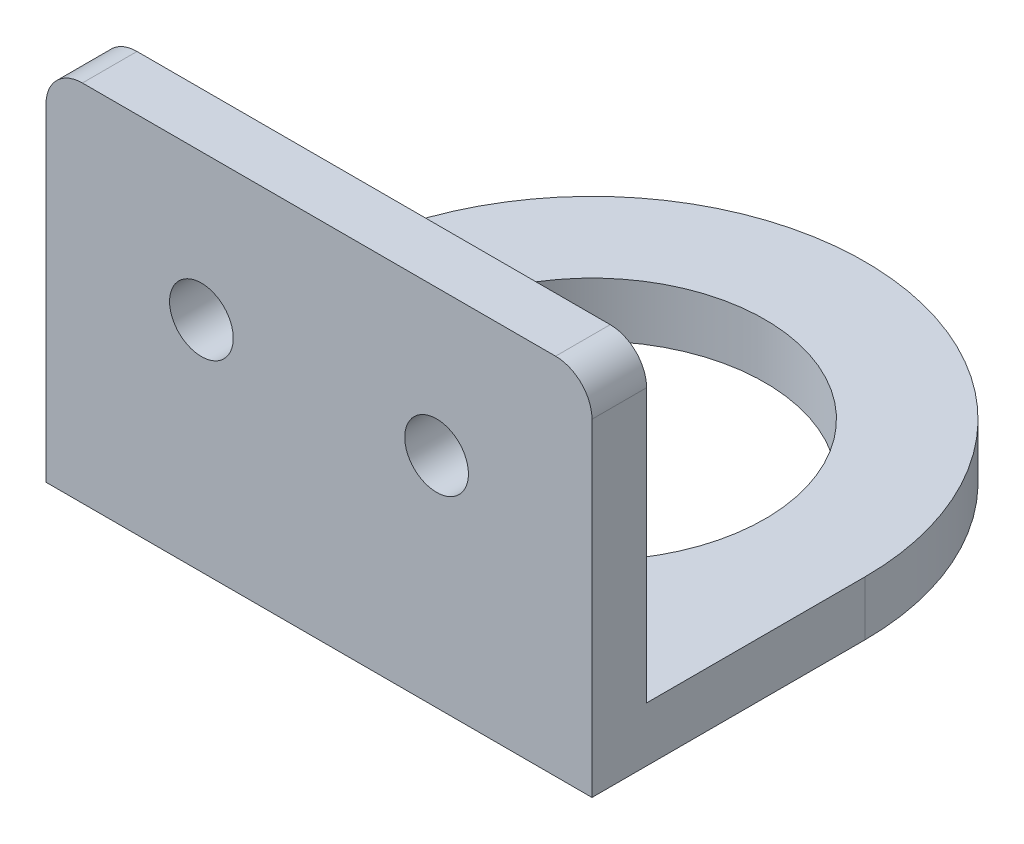
ISO-10303-21;
HEADER;
FILE_DESCRIPTION(('STEP AP214'),'2;1');
FILE_NAME('part.step','',(''),(''),'','','');
FILE_SCHEMA(('AUTOMOTIVE_DESIGN { 1 0 10303 214 1 1 1 1 }'));
ENDSEC;
DATA;
#1=APPLICATION_CONTEXT('core data for automotive mechanical design processes');
#2=APPLICATION_PROTOCOL_DEFINITION('international standard','automotive_design',2000,#1);
#3=PRODUCT_CONTEXT('',#1,'mechanical');
#4=PRODUCT('Part','Part','',(#3));
#5=PRODUCT_RELATED_PRODUCT_CATEGORY('part','',(#4));
#6=PRODUCT_DEFINITION_FORMATION('','',#4);
#7=PRODUCT_DEFINITION_CONTEXT('part definition',#1,'design');
#8=PRODUCT_DEFINITION('design','',#6,#7);
#9=PRODUCT_DEFINITION_SHAPE('','',#8);
#10=(LENGTH_UNIT() NAMED_UNIT(*) SI_UNIT(.MILLI.,.METRE.));
#11=(NAMED_UNIT(*) PLANE_ANGLE_UNIT() SI_UNIT($,.RADIAN.));
#12=(NAMED_UNIT(*) SI_UNIT($,.STERADIAN.) SOLID_ANGLE_UNIT());
#13=UNCERTAINTY_MEASURE_WITH_UNIT(LENGTH_MEASURE(1.E-05),#10,'distance_accuracy_value','');
#14=(GEOMETRIC_REPRESENTATION_CONTEXT(3) GLOBAL_UNCERTAINTY_ASSIGNED_CONTEXT((#13)) GLOBAL_UNIT_ASSIGNED_CONTEXT((#10,
#11,#12)) REPRESENTATION_CONTEXT('',''));
#15=CARTESIAN_POINT('',(0.,0.,0.));
#16=DIRECTION('',(0.,0.,1.));
#17=DIRECTION('',(1.,0.,0.));
#18=AXIS2_PLACEMENT_3D('',#15,#16,#17);
#19=CARTESIAN_POINT('',(0.,3.,15.));
#20=DIRECTION('',(0.,0.,-1.));
#21=DIRECTION('',(-1.,0.,0.));
#22=AXIS2_PLACEMENT_3D('',#19,#20,#21);
#23=PLANE('',#22);
#24=CARTESIAN_POINT('',(-6.4613791443171,12.,15.));
#25=DIRECTION('',(0.,0.,-1.));
#26=DIRECTION('',(-1.,0.,0.));
#27=AXIS2_PLACEMENT_3D('',#24,#25,#26);
#28=CIRCLE('',#27,1.75);
#29=CARTESIAN_POINT('',(-8.2113791443171,12.,15.));
#30=VERTEX_POINT('',#29);
#31=EDGE_CURVE('E246',#30,#30,#28,.T.);
#32=ORIENTED_EDGE('',*,*,#31,.T.);
#33=EDGE_LOOP('',(#32));
#34=FACE_BOUND('',#33,.T.);
#35=DIRECTION('',(0.,-1.,0.));
#36=VECTOR('',#35,1.);
#37=CARTESIAN_POINT('',(15.,3.,15.));
#38=LINE('',#37,#36);
#39=CARTESIAN_POINT('',(15.,18.,15.));
#40=VERTEX_POINT('',#39);
#41=CARTESIAN_POINT('',(15.,0.,15.));
#42=VERTEX_POINT('',#41);
#43=EDGE_CURVE('E138',#40,#42,#38,.T.);
#44=ORIENTED_EDGE('',*,*,#43,.F.);
#45=CARTESIAN_POINT('',(13.,18.,15.));
#46=DIRECTION('',(0.,0.,-1.));
#47=DIRECTION('',(-1.,0.,0.));
#48=AXIS2_PLACEMENT_3D('',#45,#46,#47);
#49=CIRCLE('',#48,2.);
#50=CARTESIAN_POINT('',(13.,20.,15.));
#51=VERTEX_POINT('',#50);
#52=EDGE_CURVE('E158',#40,#51,#49,.F.);
#53=ORIENTED_EDGE('',*,*,#52,.T.);
#54=DIRECTION('',(-1.,0.,0.));
#55=VECTOR('',#54,1.);
#56=CARTESIAN_POINT('',(-15.,20.,15.));
#57=LINE('',#56,#55);
#58=CARTESIAN_POINT('',(-13.,20.,15.));
#59=VERTEX_POINT('',#58);
#60=EDGE_CURVE('E181',#51,#59,#57,.T.);
#61=ORIENTED_EDGE('',*,*,#60,.T.);
#62=CARTESIAN_POINT('',(-13.,18.,15.));
#63=DIRECTION('',(0.,0.,-1.));
#64=DIRECTION('',(-1.,0.,0.));
#65=AXIS2_PLACEMENT_3D('',#62,#63,#64);
#66=CIRCLE('',#65,2.);
#67=CARTESIAN_POINT('',(-15.,18.,15.));
#68=VERTEX_POINT('',#67);
#69=EDGE_CURVE('E156',#59,#68,#66,.F.);
#70=ORIENTED_EDGE('',*,*,#69,.T.);
#71=DIRECTION('',(0.,-1.,0.));
#72=VECTOR('',#71,1.);
#73=CARTESIAN_POINT('',(-15.,3.,15.));
#74=LINE('',#73,#72);
#75=CARTESIAN_POINT('',(-15.,0.,15.));
#76=VERTEX_POINT('',#75);
#77=EDGE_CURVE('E151',#68,#76,#74,.T.);
#78=ORIENTED_EDGE('',*,*,#77,.T.);
#79=DIRECTION('',(1.,0.,0.));
#80=VECTOR('',#79,1.);
#81=CARTESIAN_POINT('',(0.,0.,15.));
#82=LINE('',#81,#80);
#83=EDGE_CURVE('E133',#76,#42,#82,.T.);
#84=ORIENTED_EDGE('',*,*,#83,.T.);
#85=EDGE_LOOP('',(#44,#53,#61,#70,#78,#84));
#86=FACE_BOUND('',#85,.T.);
#87=CARTESIAN_POINT('',(6.4613791443171,12.,15.));
#88=DIRECTION('',(0.,0.,1.));
#89=DIRECTION('',(1.,0.,0.));
#90=AXIS2_PLACEMENT_3D('',#87,#88,#89);
#91=CIRCLE('',#90,1.75);
#92=CARTESIAN_POINT('',(8.2113791443171,12.,15.));
#93=VERTEX_POINT('',#92);
#94=EDGE_CURVE('E185',#93,#93,#91,.T.);
#95=ORIENTED_EDGE('',*,*,#94,.F.);
#96=EDGE_LOOP('',(#95));
#97=FACE_BOUND('',#96,.T.);
#98=ADVANCED_FACE('F37',(#34,#86,#97),#23,.F.);
#99=CARTESIAN_POINT('',(0.,0.,12.));
#100=DIRECTION('',(0.,0.,-1.));
#101=DIRECTION('',(-1.,0.,0.));
#102=AXIS2_PLACEMENT_3D('',#99,#100,#101);
#103=PLANE('',#102);
#104=DIRECTION('',(-1.,0.,0.));
#105=VECTOR('',#104,1.);
#106=CARTESIAN_POINT('',(-15.,20.,12.));
#107=LINE('',#106,#105);
#108=CARTESIAN_POINT('',(13.,20.,12.));
#109=VERTEX_POINT('',#108);
#110=CARTESIAN_POINT('',(-13.,20.,12.));
#111=VERTEX_POINT('',#110);
#112=EDGE_CURVE('E169',#109,#111,#107,.T.);
#113=ORIENTED_EDGE('',*,*,#112,.F.);
#114=CARTESIAN_POINT('',(13.,18.,12.));
#115=DIRECTION('',(0.,0.,-1.));
#116=DIRECTION('',(-1.,0.,0.));
#117=AXIS2_PLACEMENT_3D('',#114,#115,#116);
#118=CIRCLE('',#117,2.);
#119=CARTESIAN_POINT('',(15.,18.,12.));
#120=VERTEX_POINT('',#119);
#121=EDGE_CURVE('E45',#109,#120,#118,.T.);
#122=ORIENTED_EDGE('',*,*,#121,.T.);
#123=DIRECTION('',(0.,1.,0.));
#124=VECTOR('',#123,1.);
#125=CARTESIAN_POINT('',(15.,0.,12.));
#126=LINE('',#125,#124);
#127=CARTESIAN_POINT('',(15.,3.,12.));
#128=VERTEX_POINT('',#127);
#129=EDGE_CURVE('E168',#128,#120,#126,.T.);
#130=ORIENTED_EDGE('',*,*,#129,.F.);
#131=DIRECTION('',(-1.,0.,0.));
#132=VECTOR('',#131,1.);
#133=CARTESIAN_POINT('',(0.,3.,12.));
#134=LINE('',#133,#132);
#135=CARTESIAN_POINT('',(-15.,3.,12.));
#136=VERTEX_POINT('',#135);
#137=EDGE_CURVE('E129',#128,#136,#134,.T.);
#138=ORIENTED_EDGE('',*,*,#137,.T.);
#139=DIRECTION('',(0.,-1.,0.));
#140=VECTOR('',#139,1.);
#141=CARTESIAN_POINT('',(-15.,0.,12.));
#142=LINE('',#141,#140);
#143=CARTESIAN_POINT('',(-15.,18.,12.));
#144=VERTEX_POINT('',#143);
#145=EDGE_CURVE('E174',#144,#136,#142,.T.);
#146=ORIENTED_EDGE('',*,*,#145,.F.);
#147=CARTESIAN_POINT('',(-13.,18.,12.));
#148=DIRECTION('',(0.,0.,-1.));
#149=DIRECTION('',(-1.,0.,0.));
#150=AXIS2_PLACEMENT_3D('',#147,#148,#149);
#151=CIRCLE('',#150,2.);
#152=EDGE_CURVE('E57',#144,#111,#151,.T.);
#153=ORIENTED_EDGE('',*,*,#152,.T.);
#154=EDGE_LOOP('',(#113,#122,#130,#138,#146,#153));
#155=FACE_BOUND('',#154,.T.);
#156=CARTESIAN_POINT('',(-6.4613791443171,12.,12.));
#157=DIRECTION('',(0.,0.,-1.));
#158=DIRECTION('',(-1.,0.,0.));
#159=AXIS2_PLACEMENT_3D('',#156,#157,#158);
#160=CIRCLE('',#159,1.75);
#161=CARTESIAN_POINT('',(-8.2113791443171,12.,12.));
#162=VERTEX_POINT('',#161);
#163=EDGE_CURVE('E243',#162,#162,#160,.T.);
#164=ORIENTED_EDGE('',*,*,#163,.F.);
#165=EDGE_LOOP('',(#164));
#166=FACE_BOUND('',#165,.T.);
#167=CARTESIAN_POINT('',(6.4613791443171,12.,12.));
#168=DIRECTION('',(0.,0.,1.));
#169=DIRECTION('',(1.,0.,0.));
#170=AXIS2_PLACEMENT_3D('',#167,#168,#169);
#171=CIRCLE('',#170,1.75);
#172=CARTESIAN_POINT('',(8.2113791443171,12.,12.));
#173=VERTEX_POINT('',#172);
#174=EDGE_CURVE('E189',#173,#173,#171,.T.);
#175=ORIENTED_EDGE('',*,*,#174,.T.);
#176=EDGE_LOOP('',(#175));
#177=FACE_BOUND('',#176,.T.);
#178=ADVANCED_FACE('F166',(#155,#166,#177),#103,.T.);
#179=CARTESIAN_POINT('',(15.,3.,0.));
#180=DIRECTION('',(1.,0.,0.));
#181=DIRECTION('',(0.,0.,-1.));
#182=AXIS2_PLACEMENT_3D('',#179,#180,#181);
#183=PLANE('',#182);
#184=ORIENTED_EDGE('',*,*,#129,.T.);
#185=DIRECTION('',(0.,0.,1.));
#186=VECTOR('',#185,1.);
#187=CARTESIAN_POINT('',(15.,18.,0.));
#188=LINE('',#187,#186);
#189=EDGE_CURVE('E114',#120,#40,#188,.T.);
#190=ORIENTED_EDGE('',*,*,#189,.T.);
#191=ORIENTED_EDGE('',*,*,#43,.T.);
#192=DIRECTION('',(0.,0.,1.));
#193=VECTOR('',#192,1.);
#194=CARTESIAN_POINT('',(15.,0.,0.));
#195=LINE('',#194,#193);
#196=CARTESIAN_POINT('',(15.,0.,0.));
#197=VERTEX_POINT('',#196);
#198=EDGE_CURVE('E110',#197,#42,#195,.T.);
#199=ORIENTED_EDGE('',*,*,#198,.F.);
#200=DIRECTION('',(0.,-1.,0.));
#201=VECTOR('',#200,1.);
#202=CARTESIAN_POINT('',(15.,3.,0.));
#203=LINE('',#202,#201);
#204=CARTESIAN_POINT('',(15.,3.,0.));
#205=VERTEX_POINT('',#204);
#206=EDGE_CURVE('E102',#205,#197,#203,.T.);
#207=ORIENTED_EDGE('',*,*,#206,.F.);
#208=DIRECTION('',(0.,0.,1.));
#209=VECTOR('',#208,1.);
#210=CARTESIAN_POINT('',(15.,3.,0.));
#211=LINE('',#210,#209);
#212=EDGE_CURVE('E107',#205,#128,#211,.T.);
#213=ORIENTED_EDGE('',*,*,#212,.T.);
#214=EDGE_LOOP('',(#184,#190,#191,#199,#207,#213));
#215=FACE_BOUND('',#214,.T.);
#216=ADVANCED_FACE('F105',(#215),#183,.T.);
#217=CARTESIAN_POINT('',(0.,3.,0.));
#218=DIRECTION('',(0.,-1.,0.));
#219=DIRECTION('',(0.,0.,-1.));
#220=AXIS2_PLACEMENT_3D('',#217,#218,#219);
#221=CYLINDRICAL_SURFACE('',#220,15.);
#222=CARTESIAN_POINT('',(0.,0.,0.));
#223=DIRECTION('',(0.,1.,0.));
#224=DIRECTION('',(0.,0.,1.));
#225=AXIS2_PLACEMENT_3D('',#222,#223,#224);
#226=CIRCLE('',#225,15.);
#227=CARTESIAN_POINT('',(-15.,0.,0.));
#228=VERTEX_POINT('',#227);
#229=EDGE_CURVE('E143',#197,#228,#226,.T.);
#230=ORIENTED_EDGE('',*,*,#229,.T.);
#231=DIRECTION('',(0.,-1.,0.));
#232=VECTOR('',#231,1.);
#233=CARTESIAN_POINT('',(-15.,3.,0.));
#234=LINE('',#233,#232);
#235=CARTESIAN_POINT('',(-15.,3.,0.));
#236=VERTEX_POINT('',#235);
#237=EDGE_CURVE('E115',#236,#228,#234,.T.);
#238=ORIENTED_EDGE('',*,*,#237,.F.);
#239=CARTESIAN_POINT('',(0.,3.,0.));
#240=DIRECTION('',(0.,1.,0.));
#241=DIRECTION('',(0.,0.,1.));
#242=AXIS2_PLACEMENT_3D('',#239,#240,#241);
#243=CIRCLE('',#242,15.);
#244=EDGE_CURVE('E119',#205,#236,#243,.T.);
#245=ORIENTED_EDGE('',*,*,#244,.F.);
#246=ORIENTED_EDGE('',*,*,#206,.T.);
#247=EDGE_LOOP('',(#230,#238,#245,#246));
#248=FACE_BOUND('',#247,.T.);
#249=ADVANCED_FACE('F120',(#248),#221,.T.);
#250=CARTESIAN_POINT('',(-15.,3.,0.));
#251=DIRECTION('',(1.,0.,0.));
#252=DIRECTION('',(0.,0.,-1.));
#253=AXIS2_PLACEMENT_3D('',#250,#251,#252);
#254=PLANE('',#253);
#255=ORIENTED_EDGE('',*,*,#77,.F.);
#256=DIRECTION('',(0.,0.,1.));
#257=VECTOR('',#256,1.);
#258=CARTESIAN_POINT('',(-15.,18.,12.));
#259=LINE('',#258,#257);
#260=EDGE_CURVE('E11',#68,#144,#259,.F.);
#261=ORIENTED_EDGE('',*,*,#260,.T.);
#262=ORIENTED_EDGE('',*,*,#145,.T.);
#263=DIRECTION('',(0.,0.,1.));
#264=VECTOR('',#263,1.);
#265=CARTESIAN_POINT('',(-15.,3.,0.));
#266=LINE('',#265,#264);
#267=EDGE_CURVE('E124',#236,#136,#266,.T.);
#268=ORIENTED_EDGE('',*,*,#267,.F.);
#269=ORIENTED_EDGE('',*,*,#237,.T.);
#270=DIRECTION('',(0.,0.,1.));
#271=VECTOR('',#270,1.);
#272=CARTESIAN_POINT('',(-15.,0.,0.));
#273=LINE('',#272,#271);
#274=EDGE_CURVE('E145',#228,#76,#273,.T.);
#275=ORIENTED_EDGE('',*,*,#274,.T.);
#276=EDGE_LOOP('',(#255,#261,#262,#268,#269,#275));
#277=FACE_BOUND('',#276,.T.);
#278=ADVANCED_FACE('F193',(#277),#254,.F.);
#279=CARTESIAN_POINT('',(0.,3.,0.));
#280=DIRECTION('',(0.,-1.,0.));
#281=DIRECTION('',(0.,0.,-1.));
#282=AXIS2_PLACEMENT_3D('',#279,#280,#281);
#283=CYLINDRICAL_SURFACE('',#282,9.5);
#284=CARTESIAN_POINT('',(0.,3.,0.));
#285=DIRECTION('',(0.,1.,0.));
#286=DIRECTION('',(0.,0.,1.));
#287=AXIS2_PLACEMENT_3D('',#284,#285,#286);
#288=CIRCLE('',#287,9.5);
#289=CARTESIAN_POINT('',(0.,3.,9.5));
#290=VERTEX_POINT('',#289);
#291=EDGE_CURVE('E130',#290,#290,#288,.T.);
#292=ORIENTED_EDGE('',*,*,#291,.T.);
#293=EDGE_LOOP('',(#292));
#294=FACE_BOUND('',#293,.T.);
#295=CARTESIAN_POINT('',(0.,0.,0.));
#296=DIRECTION('',(0.,1.,0.));
#297=DIRECTION('',(0.,0.,1.));
#298=AXIS2_PLACEMENT_3D('',#295,#296,#297);
#299=CIRCLE('',#298,9.5);
#300=CARTESIAN_POINT('',(0.,0.,9.5));
#301=VERTEX_POINT('',#300);
#302=EDGE_CURVE('E139',#301,#301,#299,.T.);
#303=ORIENTED_EDGE('',*,*,#302,.F.);
#304=EDGE_LOOP('',(#303));
#305=FACE_BOUND('',#304,.T.);
#306=ADVANCED_FACE('F206',(#294,#305),#283,.F.);
#307=CARTESIAN_POINT('',(0.,3.,0.));
#308=DIRECTION('',(0.,1.,0.));
#309=DIRECTION('',(0.,0.,1.));
#310=AXIS2_PLACEMENT_3D('',#307,#308,#309);
#311=PLANE('',#310);
#312=ORIENTED_EDGE('',*,*,#137,.F.);
#313=ORIENTED_EDGE('',*,*,#212,.F.);
#314=ORIENTED_EDGE('',*,*,#244,.T.);
#315=ORIENTED_EDGE('',*,*,#267,.T.);
#316=EDGE_LOOP('',(#312,#313,#314,#315));
#317=FACE_BOUND('',#316,.T.);
#318=ORIENTED_EDGE('',*,*,#291,.F.);
#319=EDGE_LOOP('',(#318));
#320=FACE_BOUND('',#319,.T.);
#321=ADVANCED_FACE('F126',(#317,#320),#311,.T.);
#322=CARTESIAN_POINT('',(0.,0.,0.));
#323=DIRECTION('',(0.,1.,0.));
#324=DIRECTION('',(0.,0.,1.));
#325=AXIS2_PLACEMENT_3D('',#322,#323,#324);
#326=PLANE('',#325);
#327=ORIENTED_EDGE('',*,*,#302,.T.);
#328=EDGE_LOOP('',(#327));
#329=FACE_BOUND('',#328,.T.);
#330=ORIENTED_EDGE('',*,*,#198,.T.);
#331=ORIENTED_EDGE('',*,*,#83,.F.);
#332=ORIENTED_EDGE('',*,*,#274,.F.);
#333=ORIENTED_EDGE('',*,*,#229,.F.);
#334=EDGE_LOOP('',(#330,#331,#332,#333));
#335=FACE_BOUND('',#334,.T.);
#336=ADVANCED_FACE('F196',(#329,#335),#326,.F.);
#337=CARTESIAN_POINT('',(-15.,20.,12.));
#338=DIRECTION('',(0.,1.,0.));
#339=DIRECTION('',(0.,0.,1.));
#340=AXIS2_PLACEMENT_3D('',#337,#338,#339);
#341=PLANE('',#340);
#342=ORIENTED_EDGE('',*,*,#60,.F.);
#343=DIRECTION('',(0.,0.,1.));
#344=VECTOR('',#343,1.);
#345=CARTESIAN_POINT('',(13.,20.,12.));
#346=LINE('',#345,#344);
#347=EDGE_CURVE('E163',#51,#109,#346,.F.);
#348=ORIENTED_EDGE('',*,*,#347,.T.);
#349=ORIENTED_EDGE('',*,*,#112,.T.);
#350=DIRECTION('',(0.,0.,1.));
#351=VECTOR('',#350,1.);
#352=CARTESIAN_POINT('',(-13.,20.,15.));
#353=LINE('',#352,#351);
#354=EDGE_CURVE('E160',#111,#59,#353,.T.);
#355=ORIENTED_EDGE('',*,*,#354,.T.);
#356=EDGE_LOOP('',(#342,#348,#349,#355));
#357=FACE_BOUND('',#356,.T.);
#358=ADVANCED_FACE('F183',(#357),#341,.T.);
#359=CARTESIAN_POINT('',(-6.4613791443171,12.,15.));
#360=DIRECTION('',(0.,0.,-1.));
#361=DIRECTION('',(-1.,0.,0.));
#362=AXIS2_PLACEMENT_3D('',#359,#360,#361);
#363=CYLINDRICAL_SURFACE('',#362,1.75);
#364=ORIENTED_EDGE('',*,*,#31,.F.);
#365=EDGE_LOOP('',(#364));
#366=FACE_BOUND('',#365,.T.);
#367=ORIENTED_EDGE('',*,*,#163,.T.);
#368=EDGE_LOOP('',(#367));
#369=FACE_BOUND('',#368,.T.);
#370=ADVANCED_FACE('F204',(#366,#369),#363,.F.);
#371=CARTESIAN_POINT('',(6.4613791443171,12.,15.));
#372=DIRECTION('',(0.,0.,-1.));
#373=DIRECTION('',(-1.,0.,0.));
#374=AXIS2_PLACEMENT_3D('',#371,#372,#373);
#375=CYLINDRICAL_SURFACE('',#374,1.75);
#376=ORIENTED_EDGE('',*,*,#94,.T.);
#377=EDGE_LOOP('',(#376));
#378=FACE_BOUND('',#377,.T.);
#379=ORIENTED_EDGE('',*,*,#174,.F.);
#380=EDGE_LOOP('',(#379));
#381=FACE_BOUND('',#380,.T.);
#382=ADVANCED_FACE('F226',(#378,#381),#375,.F.);
#383=CARTESIAN_POINT('',(13.,18.,0.));
#384=DIRECTION('',(0.,0.,1.));
#385=DIRECTION('',(1.,0.,0.));
#386=AXIS2_PLACEMENT_3D('',#383,#384,#385);
#387=CYLINDRICAL_SURFACE('',#386,2.);
#388=ORIENTED_EDGE('',*,*,#121,.F.);
#389=ORIENTED_EDGE('',*,*,#347,.F.);
#390=ORIENTED_EDGE('',*,*,#52,.F.);
#391=ORIENTED_EDGE('',*,*,#189,.F.);
#392=EDGE_LOOP('',(#388,#389,#390,#391));
#393=FACE_BOUND('',#392,.T.);
#394=ADVANCED_FACE('F176',(#393),#387,.T.);
#395=CARTESIAN_POINT('',(-13.,18.,12.));
#396=DIRECTION('',(0.,0.,-1.));
#397=DIRECTION('',(-1.,0.,0.));
#398=AXIS2_PLACEMENT_3D('',#395,#396,#397);
#399=CYLINDRICAL_SURFACE('',#398,2.);
#400=ORIENTED_EDGE('',*,*,#152,.F.);
#401=ORIENTED_EDGE('',*,*,#260,.F.);
#402=ORIENTED_EDGE('',*,*,#69,.F.);
#403=ORIENTED_EDGE('',*,*,#354,.F.);
#404=EDGE_LOOP('',(#400,#401,#402,#403));
#405=FACE_BOUND('',#404,.T.);
#406=ADVANCED_FACE('F39',(#405),#399,.T.);
#407=CLOSED_SHELL('',(#98,#178,#216,#249,#278,#306,#321,#336,#358,#370,#382,#394,#406));
#408=MANIFOLD_SOLID_BREP('B2',#407);
#409=ADVANCED_BREP_SHAPE_REPRESENTATION('',(#18,#408),#14);
#410=SHAPE_DEFINITION_REPRESENTATION(#9,#409);
ENDSEC;
END-ISO-10303-21;
